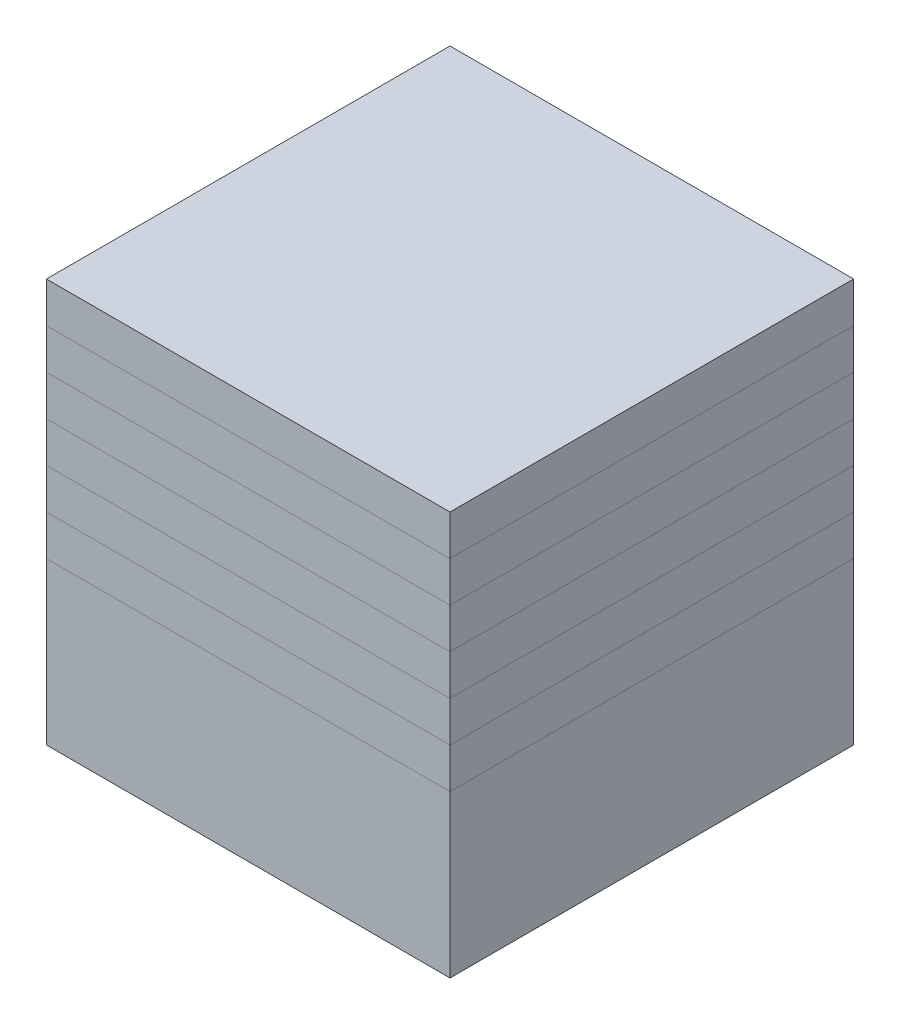
ISO-10303-21;
HEADER;
FILE_DESCRIPTION(('STEP AP214'),'2;1');
FILE_NAME('part.step','',(''),(''),'','','');
FILE_SCHEMA(('AUTOMOTIVE_DESIGN { 1 0 10303 214 1 1 1 1 }'));
ENDSEC;
DATA;
#1=APPLICATION_CONTEXT('core data for automotive mechanical design processes');
#2=APPLICATION_PROTOCOL_DEFINITION('international standard','automotive_design',2000,#1);
#3=PRODUCT_CONTEXT('',#1,'mechanical');
#4=PRODUCT('Part','Part','',(#3));
#5=PRODUCT_RELATED_PRODUCT_CATEGORY('part','',(#4));
#6=PRODUCT_DEFINITION_FORMATION('','',#4);
#7=PRODUCT_DEFINITION_CONTEXT('part definition',#1,'design');
#8=PRODUCT_DEFINITION('design','',#6,#7);
#9=PRODUCT_DEFINITION_SHAPE('','',#8);
#10=(LENGTH_UNIT() NAMED_UNIT(*) SI_UNIT(.MILLI.,.METRE.));
#11=(NAMED_UNIT(*) PLANE_ANGLE_UNIT() SI_UNIT($,.RADIAN.));
#12=(NAMED_UNIT(*) SI_UNIT($,.STERADIAN.) SOLID_ANGLE_UNIT());
#13=UNCERTAINTY_MEASURE_WITH_UNIT(LENGTH_MEASURE(1.E-05),#10,'distance_accuracy_value','');
#14=(GEOMETRIC_REPRESENTATION_CONTEXT(3) GLOBAL_UNCERTAINTY_ASSIGNED_CONTEXT((#13)) GLOBAL_UNIT_ASSIGNED_CONTEXT((#10,
#11,#12)) REPRESENTATION_CONTEXT('',''));
#15=CARTESIAN_POINT('',(0.,0.,0.));
#16=DIRECTION('',(0.,0.,1.));
#17=DIRECTION('',(1.,0.,0.));
#18=AXIS2_PLACEMENT_3D('',#15,#16,#17);
#19=CARTESIAN_POINT('',(0.,5.,0.));
#20=DIRECTION('',(1.,0.,0.));
#21=DIRECTION('',(0.,0.,-1.));
#22=AXIS2_PLACEMENT_3D('',#19,#20,#21);
#23=PLANE('',#22);
#24=DIRECTION('',(0.,0.,1.));
#25=VECTOR('',#24,1.);
#26=CARTESIAN_POINT('',(0.,0.,0.));
#27=LINE('',#26,#25);
#28=CARTESIAN_POINT('',(0.,0.,0.));
#29=VERTEX_POINT('',#28);
#30=CARTESIAN_POINT('',(0.,0.,50.));
#31=VERTEX_POINT('',#30);
#32=EDGE_CURVE('E103',#29,#31,#27,.T.);
#33=ORIENTED_EDGE('',*,*,#32,.T.);
#34=DIRECTION('',(0.,-1.,0.));
#35=VECTOR('',#34,1.);
#36=CARTESIAN_POINT('',(0.,5.,50.));
#37=LINE('',#36,#35);
#38=CARTESIAN_POINT('',(0.,20.,50.));
#39=VERTEX_POINT('',#38);
#40=EDGE_CURVE('E12',#39,#31,#37,.T.);
#41=ORIENTED_EDGE('',*,*,#40,.F.);
#42=DIRECTION('',(0.,0.,1.));
#43=VECTOR('',#42,1.);
#44=CARTESIAN_POINT('',(0.,20.,0.));
#45=LINE('',#44,#43);
#46=CARTESIAN_POINT('',(0.,20.,0.));
#47=VERTEX_POINT('',#46);
#48=EDGE_CURVE('E101',#47,#39,#45,.T.);
#49=ORIENTED_EDGE('',*,*,#48,.F.);
#50=DIRECTION('',(0.,-1.,0.));
#51=VECTOR('',#50,1.);
#52=CARTESIAN_POINT('',(0.,5.,0.));
#53=LINE('',#52,#51);
#54=EDGE_CURVE('E126',#47,#29,#53,.T.);
#55=ORIENTED_EDGE('',*,*,#54,.T.);
#56=EDGE_LOOP('',(#33,#41,#49,#55));
#57=FACE_BOUND('',#56,.T.);
#58=ADVANCED_FACE('F58',(#57),#23,.F.);
#59=CARTESIAN_POINT('',(0.,5.,50.));
#60=DIRECTION('',(0.,0.,-1.));
#61=DIRECTION('',(-1.,0.,0.));
#62=AXIS2_PLACEMENT_3D('',#59,#60,#61);
#63=PLANE('',#62);
#64=DIRECTION('',(1.,0.,0.));
#65=VECTOR('',#64,1.);
#66=CARTESIAN_POINT('',(0.,0.,50.));
#67=LINE('',#66,#65);
#68=CARTESIAN_POINT('',(50.,0.,50.));
#69=VERTEX_POINT('',#68);
#70=EDGE_CURVE('E122',#31,#69,#67,.T.);
#71=ORIENTED_EDGE('',*,*,#70,.T.);
#72=DIRECTION('',(0.,-1.,0.));
#73=VECTOR('',#72,1.);
#74=CARTESIAN_POINT('',(50.,5.,50.));
#75=LINE('',#74,#73);
#76=CARTESIAN_POINT('',(50.,20.,50.));
#77=VERTEX_POINT('',#76);
#78=EDGE_CURVE('E65',#77,#69,#75,.T.);
#79=ORIENTED_EDGE('',*,*,#78,.F.);
#80=DIRECTION('',(1.,0.,0.));
#81=VECTOR('',#80,1.);
#82=CARTESIAN_POINT('',(0.,20.,50.));
#83=LINE('',#82,#81);
#84=EDGE_CURVE('E106',#39,#77,#83,.T.);
#85=ORIENTED_EDGE('',*,*,#84,.F.);
#86=ORIENTED_EDGE('',*,*,#40,.T.);
#87=EDGE_LOOP('',(#71,#79,#85,#86));
#88=FACE_BOUND('',#87,.T.);
#89=ADVANCED_FACE('F107',(#88),#63,.F.);
#90=CARTESIAN_POINT('',(50.,5.,0.));
#91=DIRECTION('',(-1.,0.,0.));
#92=DIRECTION('',(0.,0.,1.));
#93=AXIS2_PLACEMENT_3D('',#90,#91,#92);
#94=PLANE('',#93);
#95=DIRECTION('',(0.,0.,-1.));
#96=VECTOR('',#95,1.);
#97=CARTESIAN_POINT('',(50.,0.,0.));
#98=LINE('',#97,#96);
#99=CARTESIAN_POINT('',(50.,0.,0.));
#100=VERTEX_POINT('',#99);
#101=EDGE_CURVE('E80',#69,#100,#98,.T.);
#102=ORIENTED_EDGE('',*,*,#101,.T.);
#103=DIRECTION('',(0.,-1.,0.));
#104=VECTOR('',#103,1.);
#105=CARTESIAN_POINT('',(50.,5.,0.));
#106=LINE('',#105,#104);
#107=CARTESIAN_POINT('',(50.,20.,0.));
#108=VERTEX_POINT('',#107);
#109=EDGE_CURVE('E128',#108,#100,#106,.T.);
#110=ORIENTED_EDGE('',*,*,#109,.F.);
#111=DIRECTION('',(0.,0.,-1.));
#112=VECTOR('',#111,1.);
#113=CARTESIAN_POINT('',(50.,20.,0.));
#114=LINE('',#113,#112);
#115=EDGE_CURVE('E111',#77,#108,#114,.T.);
#116=ORIENTED_EDGE('',*,*,#115,.F.);
#117=ORIENTED_EDGE('',*,*,#78,.T.);
#118=EDGE_LOOP('',(#102,#110,#116,#117));
#119=FACE_BOUND('',#118,.T.);
#120=ADVANCED_FACE('F129',(#119),#94,.F.);
#121=CARTESIAN_POINT('',(0.,5.,0.));
#122=DIRECTION('',(0.,0.,1.));
#123=DIRECTION('',(1.,0.,0.));
#124=AXIS2_PLACEMENT_3D('',#121,#122,#123);
#125=PLANE('',#124);
#126=DIRECTION('',(-1.,0.,0.));
#127=VECTOR('',#126,1.);
#128=CARTESIAN_POINT('',(0.,0.,0.));
#129=LINE('',#128,#127);
#130=EDGE_CURVE('E72',#100,#29,#129,.T.);
#131=ORIENTED_EDGE('',*,*,#130,.T.);
#132=ORIENTED_EDGE('',*,*,#54,.F.);
#133=DIRECTION('',(-1.,0.,0.));
#134=VECTOR('',#133,1.);
#135=CARTESIAN_POINT('',(0.,20.,0.));
#136=LINE('',#135,#134);
#137=EDGE_CURVE('E116',#108,#47,#136,.T.);
#138=ORIENTED_EDGE('',*,*,#137,.F.);
#139=ORIENTED_EDGE('',*,*,#109,.T.);
#140=EDGE_LOOP('',(#131,#132,#138,#139));
#141=FACE_BOUND('',#140,.T.);
#142=ADVANCED_FACE('F133',(#141),#125,.F.);
#143=CARTESIAN_POINT('',(0.,0.,0.));
#144=DIRECTION('',(0.,1.,0.));
#145=DIRECTION('',(0.,0.,1.));
#146=AXIS2_PLACEMENT_3D('',#143,#144,#145);
#147=PLANE('',#146);
#148=ORIENTED_EDGE('',*,*,#32,.F.);
#149=ORIENTED_EDGE('',*,*,#130,.F.);
#150=ORIENTED_EDGE('',*,*,#101,.F.);
#151=ORIENTED_EDGE('',*,*,#70,.F.);
#152=EDGE_LOOP('',(#148,#149,#150,#151));
#153=FACE_BOUND('',#152,.T.);
#154=ADVANCED_FACE('F131',(#153),#147,.F.);
#155=CARTESIAN_POINT('',(0.,20.,0.));
#156=DIRECTION('',(0.,1.,0.));
#157=DIRECTION('',(0.,0.,1.));
#158=AXIS2_PLACEMENT_3D('',#155,#156,#157);
#159=PLANE('',#158);
#160=ORIENTED_EDGE('',*,*,#48,.T.);
#161=ORIENTED_EDGE('',*,*,#84,.T.);
#162=ORIENTED_EDGE('',*,*,#115,.T.);
#163=ORIENTED_EDGE('',*,*,#137,.T.);
#164=EDGE_LOOP('',(#160,#161,#162,#163));
#165=FACE_BOUND('',#164,.T.);
#166=ADVANCED_FACE('F114',(#165),#159,.T.);
#167=CLOSED_SHELL('',(#58,#89,#120,#142,#154,#166));
#168=MANIFOLD_SOLID_BREP('B2',#167);
#169=CARTESIAN_POINT('',(0.,50.,0.));
#170=DIRECTION('',(1.,0.,0.));
#171=DIRECTION('',(0.,0.,-1.));
#172=AXIS2_PLACEMENT_3D('',#169,#170,#171);
#173=PLANE('',#172);
#174=DIRECTION('',(0.,0.,1.));
#175=VECTOR('',#174,1.);
#176=CARTESIAN_POINT('',(0.,45.,0.));
#177=LINE('',#176,#175);
#178=CARTESIAN_POINT('',(0.,45.,0.));
#179=VERTEX_POINT('',#178);
#180=CARTESIAN_POINT('',(0.,45.,50.));
#181=VERTEX_POINT('',#180);
#182=EDGE_CURVE('E296',#179,#181,#177,.T.);
#183=ORIENTED_EDGE('',*,*,#182,.T.);
#184=DIRECTION('',(0.,-1.,0.));
#185=VECTOR('',#184,1.);
#186=CARTESIAN_POINT('',(0.,50.,50.));
#187=LINE('',#186,#185);
#188=CARTESIAN_POINT('',(0.,50.,50.));
#189=VERTEX_POINT('',#188);
#190=EDGE_CURVE('E56',#189,#181,#187,.T.);
#191=ORIENTED_EDGE('',*,*,#190,.F.);
#192=DIRECTION('',(0.,0.,1.));
#193=VECTOR('',#192,1.);
#194=CARTESIAN_POINT('',(0.,50.,0.));
#195=LINE('',#194,#193);
#196=CARTESIAN_POINT('',(0.,50.,0.));
#197=VERTEX_POINT('',#196);
#198=EDGE_CURVE('E284',#197,#189,#195,.T.);
#199=ORIENTED_EDGE('',*,*,#198,.F.);
#200=DIRECTION('',(0.,-1.,0.));
#201=VECTOR('',#200,1.);
#202=CARTESIAN_POINT('',(0.,50.,0.));
#203=LINE('',#202,#201);
#204=EDGE_CURVE('E292',#197,#179,#203,.T.);
#205=ORIENTED_EDGE('',*,*,#204,.T.);
#206=EDGE_LOOP('',(#183,#191,#199,#205));
#207=FACE_BOUND('',#206,.T.);
#208=ADVANCED_FACE('F233',(#207),#173,.F.);
#209=CARTESIAN_POINT('',(0.,50.,50.));
#210=DIRECTION('',(0.,0.,-1.));
#211=DIRECTION('',(-1.,0.,0.));
#212=AXIS2_PLACEMENT_3D('',#209,#210,#211);
#213=PLANE('',#212);
#214=DIRECTION('',(1.,0.,0.));
#215=VECTOR('',#214,1.);
#216=CARTESIAN_POINT('',(0.,45.,50.));
#217=LINE('',#216,#215);
#218=CARTESIAN_POINT('',(50.,45.,50.));
#219=VERTEX_POINT('',#218);
#220=EDGE_CURVE('E288',#181,#219,#217,.T.);
#221=ORIENTED_EDGE('',*,*,#220,.T.);
#222=DIRECTION('',(0.,-1.,0.));
#223=VECTOR('',#222,1.);
#224=CARTESIAN_POINT('',(50.,50.,50.));
#225=LINE('',#224,#223);
#226=CARTESIAN_POINT('',(50.,50.,50.));
#227=VERTEX_POINT('',#226);
#228=EDGE_CURVE('E241',#227,#219,#225,.T.);
#229=ORIENTED_EDGE('',*,*,#228,.F.);
#230=DIRECTION('',(1.,0.,0.));
#231=VECTOR('',#230,1.);
#232=CARTESIAN_POINT('',(0.,50.,50.));
#233=LINE('',#232,#231);
#234=EDGE_CURVE('E279',#189,#227,#233,.T.);
#235=ORIENTED_EDGE('',*,*,#234,.F.);
#236=ORIENTED_EDGE('',*,*,#190,.T.);
#237=EDGE_LOOP('',(#221,#229,#235,#236));
#238=FACE_BOUND('',#237,.T.);
#239=ADVANCED_FACE('F287',(#238),#213,.F.);
#240=CARTESIAN_POINT('',(50.,50.,0.));
#241=DIRECTION('',(-1.,0.,0.));
#242=DIRECTION('',(0.,0.,1.));
#243=AXIS2_PLACEMENT_3D('',#240,#241,#242);
#244=PLANE('',#243);
#245=DIRECTION('',(0.,0.,-1.));
#246=VECTOR('',#245,1.);
#247=CARTESIAN_POINT('',(50.,45.,0.));
#248=LINE('',#247,#246);
#249=CARTESIAN_POINT('',(50.,45.,0.));
#250=VERTEX_POINT('',#249);
#251=EDGE_CURVE('E266',#219,#250,#248,.T.);
#252=ORIENTED_EDGE('',*,*,#251,.T.);
#253=DIRECTION('',(0.,-1.,0.));
#254=VECTOR('',#253,1.);
#255=CARTESIAN_POINT('',(50.,50.,0.));
#256=LINE('',#255,#254);
#257=CARTESIAN_POINT('',(50.,50.,0.));
#258=VERTEX_POINT('',#257);
#259=EDGE_CURVE('E289',#258,#250,#256,.T.);
#260=ORIENTED_EDGE('',*,*,#259,.F.);
#261=DIRECTION('',(0.,0.,-1.));
#262=VECTOR('',#261,1.);
#263=CARTESIAN_POINT('',(50.,50.,0.));
#264=LINE('',#263,#262);
#265=EDGE_CURVE('E282',#227,#258,#264,.T.);
#266=ORIENTED_EDGE('',*,*,#265,.F.);
#267=ORIENTED_EDGE('',*,*,#228,.T.);
#268=EDGE_LOOP('',(#252,#260,#266,#267));
#269=FACE_BOUND('',#268,.T.);
#270=ADVANCED_FACE('F290',(#269),#244,.F.);
#271=CARTESIAN_POINT('',(0.,50.,0.));
#272=DIRECTION('',(0.,0.,1.));
#273=DIRECTION('',(1.,0.,0.));
#274=AXIS2_PLACEMENT_3D('',#271,#272,#273);
#275=PLANE('',#274);
#276=DIRECTION('',(-1.,0.,0.));
#277=VECTOR('',#276,1.);
#278=CARTESIAN_POINT('',(0.,45.,0.));
#279=LINE('',#278,#277);
#280=EDGE_CURVE('E272',#250,#179,#279,.T.);
#281=ORIENTED_EDGE('',*,*,#280,.T.);
#282=ORIENTED_EDGE('',*,*,#204,.F.);
#283=DIRECTION('',(-1.,0.,0.));
#284=VECTOR('',#283,1.);
#285=CARTESIAN_POINT('',(0.,50.,0.));
#286=LINE('',#285,#284);
#287=EDGE_CURVE('E249',#258,#197,#286,.T.);
#288=ORIENTED_EDGE('',*,*,#287,.F.);
#289=ORIENTED_EDGE('',*,*,#259,.T.);
#290=EDGE_LOOP('',(#281,#282,#288,#289));
#291=FACE_BOUND('',#290,.T.);
#292=ADVANCED_FACE('F303',(#291),#275,.F.);
#293=CARTESIAN_POINT('',(0.,50.,0.));
#294=DIRECTION('',(0.,1.,0.));
#295=DIRECTION('',(0.,0.,1.));
#296=AXIS2_PLACEMENT_3D('',#293,#294,#295);
#297=PLANE('',#296);
#298=ORIENTED_EDGE('',*,*,#198,.T.);
#299=ORIENTED_EDGE('',*,*,#234,.T.);
#300=ORIENTED_EDGE('',*,*,#265,.T.);
#301=ORIENTED_EDGE('',*,*,#287,.T.);
#302=EDGE_LOOP('',(#298,#299,#300,#301));
#303=FACE_BOUND('',#302,.T.);
#304=ADVANCED_FACE('F280',(#303),#297,.T.);
#305=CARTESIAN_POINT('',(0.,45.,0.));
#306=DIRECTION('',(0.,1.,0.));
#307=DIRECTION('',(0.,0.,1.));
#308=AXIS2_PLACEMENT_3D('',#305,#306,#307);
#309=PLANE('',#308);
#310=ORIENTED_EDGE('',*,*,#182,.F.);
#311=ORIENTED_EDGE('',*,*,#280,.F.);
#312=ORIENTED_EDGE('',*,*,#251,.F.);
#313=ORIENTED_EDGE('',*,*,#220,.F.);
#314=EDGE_LOOP('',(#310,#311,#312,#313));
#315=FACE_BOUND('',#314,.T.);
#316=ADVANCED_FACE('F306',(#315),#309,.F.);
#317=CLOSED_SHELL('',(#208,#239,#270,#292,#304,#316));
#318=MANIFOLD_SOLID_BREP('B6',#317);
#319=CARTESIAN_POINT('',(0.,45.,0.));
#320=DIRECTION('',(1.,0.,0.));
#321=DIRECTION('',(0.,0.,-1.));
#322=AXIS2_PLACEMENT_3D('',#319,#320,#321);
#323=PLANE('',#322);
#324=DIRECTION('',(0.,0.,1.));
#325=VECTOR('',#324,1.);
#326=CARTESIAN_POINT('',(0.,40.,0.));
#327=LINE('',#326,#325);
#328=CARTESIAN_POINT('',(0.,40.,0.));
#329=VERTEX_POINT('',#328);
#330=CARTESIAN_POINT('',(0.,40.,50.));
#331=VERTEX_POINT('',#330);
#332=EDGE_CURVE('E430',#329,#331,#327,.T.);
#333=ORIENTED_EDGE('',*,*,#332,.T.);
#334=DIRECTION('',(0.,-1.,0.));
#335=VECTOR('',#334,1.);
#336=CARTESIAN_POINT('',(0.,45.,50.));
#337=LINE('',#336,#335);
#338=CARTESIAN_POINT('',(0.,45.,50.));
#339=VERTEX_POINT('',#338);
#340=EDGE_CURVE('E231',#339,#331,#337,.T.);
#341=ORIENTED_EDGE('',*,*,#340,.F.);
#342=DIRECTION('',(0.,0.,1.));
#343=VECTOR('',#342,1.);
#344=CARTESIAN_POINT('',(0.,45.,0.));
#345=LINE('',#344,#343);
#346=CARTESIAN_POINT('',(0.,45.,0.));
#347=VERTEX_POINT('',#346);
#348=EDGE_CURVE('E418',#347,#339,#345,.T.);
#349=ORIENTED_EDGE('',*,*,#348,.F.);
#350=DIRECTION('',(0.,-1.,0.));
#351=VECTOR('',#350,1.);
#352=CARTESIAN_POINT('',(0.,45.,0.));
#353=LINE('',#352,#351);
#354=EDGE_CURVE('E426',#347,#329,#353,.T.);
#355=ORIENTED_EDGE('',*,*,#354,.T.);
#356=EDGE_LOOP('',(#333,#341,#349,#355));
#357=FACE_BOUND('',#356,.T.);
#358=ADVANCED_FACE('F367',(#357),#323,.F.);
#359=CARTESIAN_POINT('',(0.,45.,50.));
#360=DIRECTION('',(0.,0.,-1.));
#361=DIRECTION('',(-1.,0.,0.));
#362=AXIS2_PLACEMENT_3D('',#359,#360,#361);
#363=PLANE('',#362);
#364=DIRECTION('',(1.,0.,0.));
#365=VECTOR('',#364,1.);
#366=CARTESIAN_POINT('',(0.,40.,50.));
#367=LINE('',#366,#365);
#368=CARTESIAN_POINT('',(50.,40.,50.));
#369=VERTEX_POINT('',#368);
#370=EDGE_CURVE('E422',#331,#369,#367,.T.);
#371=ORIENTED_EDGE('',*,*,#370,.T.);
#372=DIRECTION('',(0.,-1.,0.));
#373=VECTOR('',#372,1.);
#374=CARTESIAN_POINT('',(50.,45.,50.));
#375=LINE('',#374,#373);
#376=CARTESIAN_POINT('',(50.,45.,50.));
#377=VERTEX_POINT('',#376);
#378=EDGE_CURVE('E375',#377,#369,#375,.T.);
#379=ORIENTED_EDGE('',*,*,#378,.F.);
#380=DIRECTION('',(1.,0.,0.));
#381=VECTOR('',#380,1.);
#382=CARTESIAN_POINT('',(0.,45.,50.));
#383=LINE('',#382,#381);
#384=EDGE_CURVE('E413',#339,#377,#383,.T.);
#385=ORIENTED_EDGE('',*,*,#384,.F.);
#386=ORIENTED_EDGE('',*,*,#340,.T.);
#387=EDGE_LOOP('',(#371,#379,#385,#386));
#388=FACE_BOUND('',#387,.T.);
#389=ADVANCED_FACE('F421',(#388),#363,.F.);
#390=CARTESIAN_POINT('',(50.,45.,0.));
#391=DIRECTION('',(-1.,0.,0.));
#392=DIRECTION('',(0.,0.,1.));
#393=AXIS2_PLACEMENT_3D('',#390,#391,#392);
#394=PLANE('',#393);
#395=DIRECTION('',(0.,0.,-1.));
#396=VECTOR('',#395,1.);
#397=CARTESIAN_POINT('',(50.,40.,0.));
#398=LINE('',#397,#396);
#399=CARTESIAN_POINT('',(50.,40.,0.));
#400=VERTEX_POINT('',#399);
#401=EDGE_CURVE('E400',#369,#400,#398,.T.);
#402=ORIENTED_EDGE('',*,*,#401,.T.);
#403=DIRECTION('',(0.,-1.,0.));
#404=VECTOR('',#403,1.);
#405=CARTESIAN_POINT('',(50.,45.,0.));
#406=LINE('',#405,#404);
#407=CARTESIAN_POINT('',(50.,45.,0.));
#408=VERTEX_POINT('',#407);
#409=EDGE_CURVE('E423',#408,#400,#406,.T.);
#410=ORIENTED_EDGE('',*,*,#409,.F.);
#411=DIRECTION('',(0.,0.,-1.));
#412=VECTOR('',#411,1.);
#413=CARTESIAN_POINT('',(50.,45.,0.));
#414=LINE('',#413,#412);
#415=EDGE_CURVE('E416',#377,#408,#414,.T.);
#416=ORIENTED_EDGE('',*,*,#415,.F.);
#417=ORIENTED_EDGE('',*,*,#378,.T.);
#418=EDGE_LOOP('',(#402,#410,#416,#417));
#419=FACE_BOUND('',#418,.T.);
#420=ADVANCED_FACE('F424',(#419),#394,.F.);
#421=CARTESIAN_POINT('',(0.,45.,0.));
#422=DIRECTION('',(0.,0.,1.));
#423=DIRECTION('',(1.,0.,0.));
#424=AXIS2_PLACEMENT_3D('',#421,#422,#423);
#425=PLANE('',#424);
#426=DIRECTION('',(-1.,0.,0.));
#427=VECTOR('',#426,1.);
#428=CARTESIAN_POINT('',(0.,40.,0.));
#429=LINE('',#428,#427);
#430=EDGE_CURVE('E406',#400,#329,#429,.T.);
#431=ORIENTED_EDGE('',*,*,#430,.T.);
#432=ORIENTED_EDGE('',*,*,#354,.F.);
#433=DIRECTION('',(-1.,0.,0.));
#434=VECTOR('',#433,1.);
#435=CARTESIAN_POINT('',(0.,45.,0.));
#436=LINE('',#435,#434);
#437=EDGE_CURVE('E383',#408,#347,#436,.T.);
#438=ORIENTED_EDGE('',*,*,#437,.F.);
#439=ORIENTED_EDGE('',*,*,#409,.T.);
#440=EDGE_LOOP('',(#431,#432,#438,#439));
#441=FACE_BOUND('',#440,.T.);
#442=ADVANCED_FACE('F437',(#441),#425,.F.);
#443=CARTESIAN_POINT('',(0.,45.,0.));
#444=DIRECTION('',(0.,1.,0.));
#445=DIRECTION('',(0.,0.,1.));
#446=AXIS2_PLACEMENT_3D('',#443,#444,#445);
#447=PLANE('',#446);
#448=ORIENTED_EDGE('',*,*,#348,.T.);
#449=ORIENTED_EDGE('',*,*,#384,.T.);
#450=ORIENTED_EDGE('',*,*,#415,.T.);
#451=ORIENTED_EDGE('',*,*,#437,.T.);
#452=EDGE_LOOP('',(#448,#449,#450,#451));
#453=FACE_BOUND('',#452,.T.);
#454=ADVANCED_FACE('F414',(#453),#447,.T.);
#455=CARTESIAN_POINT('',(0.,40.,0.));
#456=DIRECTION('',(0.,1.,0.));
#457=DIRECTION('',(0.,0.,1.));
#458=AXIS2_PLACEMENT_3D('',#455,#456,#457);
#459=PLANE('',#458);
#460=ORIENTED_EDGE('',*,*,#332,.F.);
#461=ORIENTED_EDGE('',*,*,#430,.F.);
#462=ORIENTED_EDGE('',*,*,#401,.F.);
#463=ORIENTED_EDGE('',*,*,#370,.F.);
#464=EDGE_LOOP('',(#460,#461,#462,#463));
#465=FACE_BOUND('',#464,.T.);
#466=ADVANCED_FACE('F440',(#465),#459,.F.);
#467=CLOSED_SHELL('',(#358,#389,#420,#442,#454,#466));
#468=MANIFOLD_SOLID_BREP('B50',#467);
#469=CARTESIAN_POINT('',(0.,40.,0.));
#470=DIRECTION('',(1.,0.,0.));
#471=DIRECTION('',(0.,0.,-1.));
#472=AXIS2_PLACEMENT_3D('',#469,#470,#471);
#473=PLANE('',#472);
#474=DIRECTION('',(0.,0.,1.));
#475=VECTOR('',#474,1.);
#476=CARTESIAN_POINT('',(0.,35.,0.));
#477=LINE('',#476,#475);
#478=CARTESIAN_POINT('',(0.,35.,0.));
#479=VERTEX_POINT('',#478);
#480=CARTESIAN_POINT('',(0.,35.,50.));
#481=VERTEX_POINT('',#480);
#482=EDGE_CURVE('E564',#479,#481,#477,.T.);
#483=ORIENTED_EDGE('',*,*,#482,.T.);
#484=DIRECTION('',(0.,-1.,0.));
#485=VECTOR('',#484,1.);
#486=CARTESIAN_POINT('',(0.,40.,50.));
#487=LINE('',#486,#485);
#488=CARTESIAN_POINT('',(0.,40.,50.));
#489=VERTEX_POINT('',#488);
#490=EDGE_CURVE('E365',#489,#481,#487,.T.);
#491=ORIENTED_EDGE('',*,*,#490,.F.);
#492=DIRECTION('',(0.,0.,1.));
#493=VECTOR('',#492,1.);
#494=CARTESIAN_POINT('',(0.,40.,0.));
#495=LINE('',#494,#493);
#496=CARTESIAN_POINT('',(0.,40.,0.));
#497=VERTEX_POINT('',#496);
#498=EDGE_CURVE('E552',#497,#489,#495,.T.);
#499=ORIENTED_EDGE('',*,*,#498,.F.);
#500=DIRECTION('',(0.,-1.,0.));
#501=VECTOR('',#500,1.);
#502=CARTESIAN_POINT('',(0.,40.,0.));
#503=LINE('',#502,#501);
#504=EDGE_CURVE('E560',#497,#479,#503,.T.);
#505=ORIENTED_EDGE('',*,*,#504,.T.);
#506=EDGE_LOOP('',(#483,#491,#499,#505));
#507=FACE_BOUND('',#506,.T.);
#508=ADVANCED_FACE('F501',(#507),#473,.F.);
#509=CARTESIAN_POINT('',(0.,40.,50.));
#510=DIRECTION('',(0.,0.,-1.));
#511=DIRECTION('',(-1.,0.,0.));
#512=AXIS2_PLACEMENT_3D('',#509,#510,#511);
#513=PLANE('',#512);
#514=DIRECTION('',(1.,0.,0.));
#515=VECTOR('',#514,1.);
#516=CARTESIAN_POINT('',(0.,35.,50.));
#517=LINE('',#516,#515);
#518=CARTESIAN_POINT('',(50.,35.,50.));
#519=VERTEX_POINT('',#518);
#520=EDGE_CURVE('E556',#481,#519,#517,.T.);
#521=ORIENTED_EDGE('',*,*,#520,.T.);
#522=DIRECTION('',(0.,-1.,0.));
#523=VECTOR('',#522,1.);
#524=CARTESIAN_POINT('',(50.,40.,50.));
#525=LINE('',#524,#523);
#526=CARTESIAN_POINT('',(50.,40.,50.));
#527=VERTEX_POINT('',#526);
#528=EDGE_CURVE('E509',#527,#519,#525,.T.);
#529=ORIENTED_EDGE('',*,*,#528,.F.);
#530=DIRECTION('',(1.,0.,0.));
#531=VECTOR('',#530,1.);
#532=CARTESIAN_POINT('',(0.,40.,50.));
#533=LINE('',#532,#531);
#534=EDGE_CURVE('E547',#489,#527,#533,.T.);
#535=ORIENTED_EDGE('',*,*,#534,.F.);
#536=ORIENTED_EDGE('',*,*,#490,.T.);
#537=EDGE_LOOP('',(#521,#529,#535,#536));
#538=FACE_BOUND('',#537,.T.);
#539=ADVANCED_FACE('F555',(#538),#513,.F.);
#540=CARTESIAN_POINT('',(50.,40.,0.));
#541=DIRECTION('',(-1.,0.,0.));
#542=DIRECTION('',(0.,0.,1.));
#543=AXIS2_PLACEMENT_3D('',#540,#541,#542);
#544=PLANE('',#543);
#545=DIRECTION('',(0.,0.,-1.));
#546=VECTOR('',#545,1.);
#547=CARTESIAN_POINT('',(50.,35.,0.));
#548=LINE('',#547,#546);
#549=CARTESIAN_POINT('',(50.,35.,0.));
#550=VERTEX_POINT('',#549);
#551=EDGE_CURVE('E534',#519,#550,#548,.T.);
#552=ORIENTED_EDGE('',*,*,#551,.T.);
#553=DIRECTION('',(0.,-1.,0.));
#554=VECTOR('',#553,1.);
#555=CARTESIAN_POINT('',(50.,40.,0.));
#556=LINE('',#555,#554);
#557=CARTESIAN_POINT('',(50.,40.,0.));
#558=VERTEX_POINT('',#557);
#559=EDGE_CURVE('E557',#558,#550,#556,.T.);
#560=ORIENTED_EDGE('',*,*,#559,.F.);
#561=DIRECTION('',(0.,0.,-1.));
#562=VECTOR('',#561,1.);
#563=CARTESIAN_POINT('',(50.,40.,0.));
#564=LINE('',#563,#562);
#565=EDGE_CURVE('E550',#527,#558,#564,.T.);
#566=ORIENTED_EDGE('',*,*,#565,.F.);
#567=ORIENTED_EDGE('',*,*,#528,.T.);
#568=EDGE_LOOP('',(#552,#560,#566,#567));
#569=FACE_BOUND('',#568,.T.);
#570=ADVANCED_FACE('F558',(#569),#544,.F.);
#571=CARTESIAN_POINT('',(0.,40.,0.));
#572=DIRECTION('',(0.,0.,1.));
#573=DIRECTION('',(1.,0.,0.));
#574=AXIS2_PLACEMENT_3D('',#571,#572,#573);
#575=PLANE('',#574);
#576=DIRECTION('',(-1.,0.,0.));
#577=VECTOR('',#576,1.);
#578=CARTESIAN_POINT('',(0.,35.,0.));
#579=LINE('',#578,#577);
#580=EDGE_CURVE('E540',#550,#479,#579,.T.);
#581=ORIENTED_EDGE('',*,*,#580,.T.);
#582=ORIENTED_EDGE('',*,*,#504,.F.);
#583=DIRECTION('',(-1.,0.,0.));
#584=VECTOR('',#583,1.);
#585=CARTESIAN_POINT('',(0.,40.,0.));
#586=LINE('',#585,#584);
#587=EDGE_CURVE('E517',#558,#497,#586,.T.);
#588=ORIENTED_EDGE('',*,*,#587,.F.);
#589=ORIENTED_EDGE('',*,*,#559,.T.);
#590=EDGE_LOOP('',(#581,#582,#588,#589));
#591=FACE_BOUND('',#590,.T.);
#592=ADVANCED_FACE('F571',(#591),#575,.F.);
#593=CARTESIAN_POINT('',(0.,40.,0.));
#594=DIRECTION('',(0.,1.,0.));
#595=DIRECTION('',(0.,0.,1.));
#596=AXIS2_PLACEMENT_3D('',#593,#594,#595);
#597=PLANE('',#596);
#598=ORIENTED_EDGE('',*,*,#498,.T.);
#599=ORIENTED_EDGE('',*,*,#534,.T.);
#600=ORIENTED_EDGE('',*,*,#565,.T.);
#601=ORIENTED_EDGE('',*,*,#587,.T.);
#602=EDGE_LOOP('',(#598,#599,#600,#601));
#603=FACE_BOUND('',#602,.T.);
#604=ADVANCED_FACE('F548',(#603),#597,.T.);
#605=CARTESIAN_POINT('',(0.,35.,0.));
#606=DIRECTION('',(0.,1.,0.));
#607=DIRECTION('',(0.,0.,1.));
#608=AXIS2_PLACEMENT_3D('',#605,#606,#607);
#609=PLANE('',#608);
#610=ORIENTED_EDGE('',*,*,#482,.F.);
#611=ORIENTED_EDGE('',*,*,#580,.F.);
#612=ORIENTED_EDGE('',*,*,#551,.F.);
#613=ORIENTED_EDGE('',*,*,#520,.F.);
#614=EDGE_LOOP('',(#610,#611,#612,#613));
#615=FACE_BOUND('',#614,.T.);
#616=ADVANCED_FACE('F574',(#615),#609,.F.);
#617=CLOSED_SHELL('',(#508,#539,#570,#592,#604,#616));
#618=MANIFOLD_SOLID_BREP('B225',#617);
#619=CARTESIAN_POINT('',(0.,35.,0.));
#620=DIRECTION('',(1.,0.,0.));
#621=DIRECTION('',(0.,0.,-1.));
#622=AXIS2_PLACEMENT_3D('',#619,#620,#621);
#623=PLANE('',#622);
#624=DIRECTION('',(0.,0.,1.));
#625=VECTOR('',#624,1.);
#626=CARTESIAN_POINT('',(0.,30.,0.));
#627=LINE('',#626,#625);
#628=CARTESIAN_POINT('',(0.,30.,0.));
#629=VERTEX_POINT('',#628);
#630=CARTESIAN_POINT('',(0.,30.,50.));
#631=VERTEX_POINT('',#630);
#632=EDGE_CURVE('E698',#629,#631,#627,.T.);
#633=ORIENTED_EDGE('',*,*,#632,.T.);
#634=DIRECTION('',(0.,-1.,0.));
#635=VECTOR('',#634,1.);
#636=CARTESIAN_POINT('',(0.,35.,50.));
#637=LINE('',#636,#635);
#638=CARTESIAN_POINT('',(0.,35.,50.));
#639=VERTEX_POINT('',#638);
#640=EDGE_CURVE('E499',#639,#631,#637,.T.);
#641=ORIENTED_EDGE('',*,*,#640,.F.);
#642=DIRECTION('',(0.,0.,1.));
#643=VECTOR('',#642,1.);
#644=CARTESIAN_POINT('',(0.,35.,0.));
#645=LINE('',#644,#643);
#646=CARTESIAN_POINT('',(0.,35.,0.));
#647=VERTEX_POINT('',#646);
#648=EDGE_CURVE('E686',#647,#639,#645,.T.);
#649=ORIENTED_EDGE('',*,*,#648,.F.);
#650=DIRECTION('',(0.,-1.,0.));
#651=VECTOR('',#650,1.);
#652=CARTESIAN_POINT('',(0.,35.,0.));
#653=LINE('',#652,#651);
#654=EDGE_CURVE('E694',#647,#629,#653,.T.);
#655=ORIENTED_EDGE('',*,*,#654,.T.);
#656=EDGE_LOOP('',(#633,#641,#649,#655));
#657=FACE_BOUND('',#656,.T.);
#658=ADVANCED_FACE('F635',(#657),#623,.F.);
#659=CARTESIAN_POINT('',(0.,35.,50.));
#660=DIRECTION('',(0.,0.,-1.));
#661=DIRECTION('',(-1.,0.,0.));
#662=AXIS2_PLACEMENT_3D('',#659,#660,#661);
#663=PLANE('',#662);
#664=DIRECTION('',(1.,0.,0.));
#665=VECTOR('',#664,1.);
#666=CARTESIAN_POINT('',(0.,30.,50.));
#667=LINE('',#666,#665);
#668=CARTESIAN_POINT('',(50.,30.,50.));
#669=VERTEX_POINT('',#668);
#670=EDGE_CURVE('E690',#631,#669,#667,.T.);
#671=ORIENTED_EDGE('',*,*,#670,.T.);
#672=DIRECTION('',(0.,-1.,0.));
#673=VECTOR('',#672,1.);
#674=CARTESIAN_POINT('',(50.,35.,50.));
#675=LINE('',#674,#673);
#676=CARTESIAN_POINT('',(50.,35.,50.));
#677=VERTEX_POINT('',#676);
#678=EDGE_CURVE('E643',#677,#669,#675,.T.);
#679=ORIENTED_EDGE('',*,*,#678,.F.);
#680=DIRECTION('',(1.,0.,0.));
#681=VECTOR('',#680,1.);
#682=CARTESIAN_POINT('',(0.,35.,50.));
#683=LINE('',#682,#681);
#684=EDGE_CURVE('E681',#639,#677,#683,.T.);
#685=ORIENTED_EDGE('',*,*,#684,.F.);
#686=ORIENTED_EDGE('',*,*,#640,.T.);
#687=EDGE_LOOP('',(#671,#679,#685,#686));
#688=FACE_BOUND('',#687,.T.);
#689=ADVANCED_FACE('F689',(#688),#663,.F.);
#690=CARTESIAN_POINT('',(50.,35.,0.));
#691=DIRECTION('',(-1.,0.,0.));
#692=DIRECTION('',(0.,0.,1.));
#693=AXIS2_PLACEMENT_3D('',#690,#691,#692);
#694=PLANE('',#693);
#695=DIRECTION('',(0.,0.,-1.));
#696=VECTOR('',#695,1.);
#697=CARTESIAN_POINT('',(50.,30.,0.));
#698=LINE('',#697,#696);
#699=CARTESIAN_POINT('',(50.,30.,0.));
#700=VERTEX_POINT('',#699);
#701=EDGE_CURVE('E668',#669,#700,#698,.T.);
#702=ORIENTED_EDGE('',*,*,#701,.T.);
#703=DIRECTION('',(0.,-1.,0.));
#704=VECTOR('',#703,1.);
#705=CARTESIAN_POINT('',(50.,35.,0.));
#706=LINE('',#705,#704);
#707=CARTESIAN_POINT('',(50.,35.,0.));
#708=VERTEX_POINT('',#707);
#709=EDGE_CURVE('E691',#708,#700,#706,.T.);
#710=ORIENTED_EDGE('',*,*,#709,.F.);
#711=DIRECTION('',(0.,0.,-1.));
#712=VECTOR('',#711,1.);
#713=CARTESIAN_POINT('',(50.,35.,0.));
#714=LINE('',#713,#712);
#715=EDGE_CURVE('E684',#677,#708,#714,.T.);
#716=ORIENTED_EDGE('',*,*,#715,.F.);
#717=ORIENTED_EDGE('',*,*,#678,.T.);
#718=EDGE_LOOP('',(#702,#710,#716,#717));
#719=FACE_BOUND('',#718,.T.);
#720=ADVANCED_FACE('F692',(#719),#694,.F.);
#721=CARTESIAN_POINT('',(0.,35.,0.));
#722=DIRECTION('',(0.,0.,1.));
#723=DIRECTION('',(1.,0.,0.));
#724=AXIS2_PLACEMENT_3D('',#721,#722,#723);
#725=PLANE('',#724);
#726=DIRECTION('',(-1.,0.,0.));
#727=VECTOR('',#726,1.);
#728=CARTESIAN_POINT('',(0.,30.,0.));
#729=LINE('',#728,#727);
#730=EDGE_CURVE('E674',#700,#629,#729,.T.);
#731=ORIENTED_EDGE('',*,*,#730,.T.);
#732=ORIENTED_EDGE('',*,*,#654,.F.);
#733=DIRECTION('',(-1.,0.,0.));
#734=VECTOR('',#733,1.);
#735=CARTESIAN_POINT('',(0.,35.,0.));
#736=LINE('',#735,#734);
#737=EDGE_CURVE('E651',#708,#647,#736,.T.);
#738=ORIENTED_EDGE('',*,*,#737,.F.);
#739=ORIENTED_EDGE('',*,*,#709,.T.);
#740=EDGE_LOOP('',(#731,#732,#738,#739));
#741=FACE_BOUND('',#740,.T.);
#742=ADVANCED_FACE('F705',(#741),#725,.F.);
#743=CARTESIAN_POINT('',(0.,35.,0.));
#744=DIRECTION('',(0.,1.,0.));
#745=DIRECTION('',(0.,0.,1.));
#746=AXIS2_PLACEMENT_3D('',#743,#744,#745);
#747=PLANE('',#746);
#748=ORIENTED_EDGE('',*,*,#648,.T.);
#749=ORIENTED_EDGE('',*,*,#684,.T.);
#750=ORIENTED_EDGE('',*,*,#715,.T.);
#751=ORIENTED_EDGE('',*,*,#737,.T.);
#752=EDGE_LOOP('',(#748,#749,#750,#751));
#753=FACE_BOUND('',#752,.T.);
#754=ADVANCED_FACE('F682',(#753),#747,.T.);
#755=CARTESIAN_POINT('',(0.,30.,0.));
#756=DIRECTION('',(0.,1.,0.));
#757=DIRECTION('',(0.,0.,1.));
#758=AXIS2_PLACEMENT_3D('',#755,#756,#757);
#759=PLANE('',#758);
#760=ORIENTED_EDGE('',*,*,#632,.F.);
#761=ORIENTED_EDGE('',*,*,#730,.F.);
#762=ORIENTED_EDGE('',*,*,#701,.F.);
#763=ORIENTED_EDGE('',*,*,#670,.F.);
#764=EDGE_LOOP('',(#760,#761,#762,#763));
#765=FACE_BOUND('',#764,.T.);
#766=ADVANCED_FACE('F708',(#765),#759,.F.);
#767=CLOSED_SHELL('',(#658,#689,#720,#742,#754,#766));
#768=MANIFOLD_SOLID_BREP('B359',#767);
#769=CARTESIAN_POINT('',(0.,30.,0.));
#770=DIRECTION('',(1.,0.,0.));
#771=DIRECTION('',(0.,0.,-1.));
#772=AXIS2_PLACEMENT_3D('',#769,#770,#771);
#773=PLANE('',#772);
#774=DIRECTION('',(0.,0.,1.));
#775=VECTOR('',#774,1.);
#776=CARTESIAN_POINT('',(0.,25.,0.));
#777=LINE('',#776,#775);
#778=CARTESIAN_POINT('',(0.,25.,0.));
#779=VERTEX_POINT('',#778);
#780=CARTESIAN_POINT('',(0.,25.,50.));
#781=VERTEX_POINT('',#780);
#782=EDGE_CURVE('E831',#779,#781,#777,.T.);
#783=ORIENTED_EDGE('',*,*,#782,.T.);
#784=DIRECTION('',(0.,-1.,0.));
#785=VECTOR('',#784,1.);
#786=CARTESIAN_POINT('',(0.,30.,50.));
#787=LINE('',#786,#785);
#788=CARTESIAN_POINT('',(0.,30.,50.));
#789=VERTEX_POINT('',#788);
#790=EDGE_CURVE('E633',#789,#781,#787,.T.);
#791=ORIENTED_EDGE('',*,*,#790,.F.);
#792=DIRECTION('',(0.,0.,1.));
#793=VECTOR('',#792,1.);
#794=CARTESIAN_POINT('',(0.,30.,0.));
#795=LINE('',#794,#793);
#796=CARTESIAN_POINT('',(0.,30.,0.));
#797=VERTEX_POINT('',#796);
#798=EDGE_CURVE('E819',#797,#789,#795,.T.);
#799=ORIENTED_EDGE('',*,*,#798,.F.);
#800=DIRECTION('',(0.,-1.,0.));
#801=VECTOR('',#800,1.);
#802=CARTESIAN_POINT('',(0.,30.,0.));
#803=LINE('',#802,#801);
#804=EDGE_CURVE('E827',#797,#779,#803,.T.);
#805=ORIENTED_EDGE('',*,*,#804,.T.);
#806=EDGE_LOOP('',(#783,#791,#799,#805));
#807=FACE_BOUND('',#806,.T.);
#808=ADVANCED_FACE('F768',(#807),#773,.F.);
#809=CARTESIAN_POINT('',(0.,30.,50.));
#810=DIRECTION('',(0.,0.,-1.));
#811=DIRECTION('',(-1.,0.,0.));
#812=AXIS2_PLACEMENT_3D('',#809,#810,#811);
#813=PLANE('',#812);
#814=DIRECTION('',(1.,0.,0.));
#815=VECTOR('',#814,1.);
#816=CARTESIAN_POINT('',(0.,25.,50.));
#817=LINE('',#816,#815);
#818=CARTESIAN_POINT('',(50.,25.,50.));
#819=VERTEX_POINT('',#818);
#820=EDGE_CURVE('E823',#781,#819,#817,.T.);
#821=ORIENTED_EDGE('',*,*,#820,.T.);
#822=DIRECTION('',(0.,-1.,0.));
#823=VECTOR('',#822,1.);
#824=CARTESIAN_POINT('',(50.,30.,50.));
#825=LINE('',#824,#823);
#826=CARTESIAN_POINT('',(50.,30.,50.));
#827=VERTEX_POINT('',#826);
#828=EDGE_CURVE('E776',#827,#819,#825,.T.);
#829=ORIENTED_EDGE('',*,*,#828,.F.);
#830=DIRECTION('',(1.,0.,0.));
#831=VECTOR('',#830,1.);
#832=CARTESIAN_POINT('',(0.,30.,50.));
#833=LINE('',#832,#831);
#834=EDGE_CURVE('E814',#789,#827,#833,.T.);
#835=ORIENTED_EDGE('',*,*,#834,.F.);
#836=ORIENTED_EDGE('',*,*,#790,.T.);
#837=EDGE_LOOP('',(#821,#829,#835,#836));
#838=FACE_BOUND('',#837,.T.);
#839=ADVANCED_FACE('F822',(#838),#813,.F.);
#840=CARTESIAN_POINT('',(50.,30.,0.));
#841=DIRECTION('',(-1.,0.,0.));
#842=DIRECTION('',(0.,0.,1.));
#843=AXIS2_PLACEMENT_3D('',#840,#841,#842);
#844=PLANE('',#843);
#845=DIRECTION('',(0.,0.,-1.));
#846=VECTOR('',#845,1.);
#847=CARTESIAN_POINT('',(50.,25.,0.));
#848=LINE('',#847,#846);
#849=CARTESIAN_POINT('',(50.,25.,0.));
#850=VERTEX_POINT('',#849);
#851=EDGE_CURVE('E801',#819,#850,#848,.T.);
#852=ORIENTED_EDGE('',*,*,#851,.T.);
#853=DIRECTION('',(0.,-1.,0.));
#854=VECTOR('',#853,1.);
#855=CARTESIAN_POINT('',(50.,30.,0.));
#856=LINE('',#855,#854);
#857=CARTESIAN_POINT('',(50.,30.,0.));
#858=VERTEX_POINT('',#857);
#859=EDGE_CURVE('E824',#858,#850,#856,.T.);
#860=ORIENTED_EDGE('',*,*,#859,.F.);
#861=DIRECTION('',(0.,0.,-1.));
#862=VECTOR('',#861,1.);
#863=CARTESIAN_POINT('',(50.,30.,0.));
#864=LINE('',#863,#862);
#865=EDGE_CURVE('E817',#827,#858,#864,.T.);
#866=ORIENTED_EDGE('',*,*,#865,.F.);
#867=ORIENTED_EDGE('',*,*,#828,.T.);
#868=EDGE_LOOP('',(#852,#860,#866,#867));
#869=FACE_BOUND('',#868,.T.);
#870=ADVANCED_FACE('F825',(#869),#844,.F.);
#871=CARTESIAN_POINT('',(0.,30.,0.));
#872=DIRECTION('',(0.,0.,1.));
#873=DIRECTION('',(1.,0.,0.));
#874=AXIS2_PLACEMENT_3D('',#871,#872,#873);
#875=PLANE('',#874);
#876=DIRECTION('',(-1.,0.,0.));
#877=VECTOR('',#876,1.);
#878=CARTESIAN_POINT('',(0.,25.,0.));
#879=LINE('',#878,#877);
#880=EDGE_CURVE('E807',#850,#779,#879,.T.);
#881=ORIENTED_EDGE('',*,*,#880,.T.);
#882=ORIENTED_EDGE('',*,*,#804,.F.);
#883=DIRECTION('',(-1.,0.,0.));
#884=VECTOR('',#883,1.);
#885=CARTESIAN_POINT('',(0.,30.,0.));
#886=LINE('',#885,#884);
#887=EDGE_CURVE('E784',#858,#797,#886,.T.);
#888=ORIENTED_EDGE('',*,*,#887,.F.);
#889=ORIENTED_EDGE('',*,*,#859,.T.);
#890=EDGE_LOOP('',(#881,#882,#888,#889));
#891=FACE_BOUND('',#890,.T.);
#892=ADVANCED_FACE('F838',(#891),#875,.F.);
#893=CARTESIAN_POINT('',(0.,30.,0.));
#894=DIRECTION('',(0.,1.,0.));
#895=DIRECTION('',(0.,0.,1.));
#896=AXIS2_PLACEMENT_3D('',#893,#894,#895);
#897=PLANE('',#896);
#898=ORIENTED_EDGE('',*,*,#798,.T.);
#899=ORIENTED_EDGE('',*,*,#834,.T.);
#900=ORIENTED_EDGE('',*,*,#865,.T.);
#901=ORIENTED_EDGE('',*,*,#887,.T.);
#902=EDGE_LOOP('',(#898,#899,#900,#901));
#903=FACE_BOUND('',#902,.T.);
#904=ADVANCED_FACE('F815',(#903),#897,.T.);
#905=CARTESIAN_POINT('',(0.,25.,0.));
#906=DIRECTION('',(0.,1.,0.));
#907=DIRECTION('',(0.,0.,1.));
#908=AXIS2_PLACEMENT_3D('',#905,#906,#907);
#909=PLANE('',#908);
#910=ORIENTED_EDGE('',*,*,#782,.F.);
#911=ORIENTED_EDGE('',*,*,#880,.F.);
#912=ORIENTED_EDGE('',*,*,#851,.F.);
#913=ORIENTED_EDGE('',*,*,#820,.F.);
#914=EDGE_LOOP('',(#910,#911,#912,#913));
#915=FACE_BOUND('',#914,.T.);
#916=ADVANCED_FACE('F841',(#915),#909,.F.);
#917=CLOSED_SHELL('',(#808,#839,#870,#892,#904,#916));
#918=MANIFOLD_SOLID_BREP('B493',#917);
#919=CARTESIAN_POINT('',(0.,25.,0.));
#920=DIRECTION('',(1.,0.,0.));
#921=DIRECTION('',(0.,0.,-1.));
#922=AXIS2_PLACEMENT_3D('',#919,#920,#921);
#923=PLANE('',#922);
#924=DIRECTION('',(0.,0.,1.));
#925=VECTOR('',#924,1.);
#926=CARTESIAN_POINT('',(0.,20.,0.));
#927=LINE('',#926,#925);
#928=CARTESIAN_POINT('',(0.,20.,0.));
#929=VERTEX_POINT('',#928);
#930=CARTESIAN_POINT('',(0.,20.,50.));
#931=VERTEX_POINT('',#930);
#932=EDGE_CURVE('E955',#929,#931,#927,.T.);
#933=ORIENTED_EDGE('',*,*,#932,.T.);
#934=DIRECTION('',(0.,-1.,0.));
#935=VECTOR('',#934,1.);
#936=CARTESIAN_POINT('',(0.,25.,50.));
#937=LINE('',#936,#935);
#938=CARTESIAN_POINT('',(0.,25.,50.));
#939=VERTEX_POINT('',#938);
#940=EDGE_CURVE('E766',#939,#931,#937,.T.);
#941=ORIENTED_EDGE('',*,*,#940,.F.);
#942=DIRECTION('',(0.,0.,1.));
#943=VECTOR('',#942,1.);
#944=CARTESIAN_POINT('',(0.,25.,0.));
#945=LINE('',#944,#943);
#946=CARTESIAN_POINT('',(0.,25.,0.));
#947=VERTEX_POINT('',#946);
#948=EDGE_CURVE('E943',#947,#939,#945,.T.);
#949=ORIENTED_EDGE('',*,*,#948,.F.);
#950=DIRECTION('',(0.,-1.,0.));
#951=VECTOR('',#950,1.);
#952=CARTESIAN_POINT('',(0.,25.,0.));
#953=LINE('',#952,#951);
#954=EDGE_CURVE('E951',#947,#929,#953,.T.);
#955=ORIENTED_EDGE('',*,*,#954,.T.);
#956=EDGE_LOOP('',(#933,#941,#949,#955));
#957=FACE_BOUND('',#956,.T.);
#958=ADVANCED_FACE('F892',(#957),#923,.F.);
#959=CARTESIAN_POINT('',(0.,25.,50.));
#960=DIRECTION('',(0.,0.,-1.));
#961=DIRECTION('',(-1.,0.,0.));
#962=AXIS2_PLACEMENT_3D('',#959,#960,#961);
#963=PLANE('',#962);
#964=DIRECTION('',(1.,0.,0.));
#965=VECTOR('',#964,1.);
#966=CARTESIAN_POINT('',(0.,20.,50.));
#967=LINE('',#966,#965);
#968=CARTESIAN_POINT('',(50.,20.,50.));
#969=VERTEX_POINT('',#968);
#970=EDGE_CURVE('E947',#931,#969,#967,.T.);
#971=ORIENTED_EDGE('',*,*,#970,.T.);
#972=DIRECTION('',(0.,-1.,0.));
#973=VECTOR('',#972,1.);
#974=CARTESIAN_POINT('',(50.,25.,50.));
#975=LINE('',#974,#973);
#976=CARTESIAN_POINT('',(50.,25.,50.));
#977=VERTEX_POINT('',#976);
#978=EDGE_CURVE('E900',#977,#969,#975,.T.);
#979=ORIENTED_EDGE('',*,*,#978,.F.);
#980=DIRECTION('',(1.,0.,0.));
#981=VECTOR('',#980,1.);
#982=CARTESIAN_POINT('',(0.,25.,50.));
#983=LINE('',#982,#981);
#984=EDGE_CURVE('E938',#939,#977,#983,.T.);
#985=ORIENTED_EDGE('',*,*,#984,.F.);
#986=ORIENTED_EDGE('',*,*,#940,.T.);
#987=EDGE_LOOP('',(#971,#979,#985,#986));
#988=FACE_BOUND('',#987,.T.);
#989=ADVANCED_FACE('F946',(#988),#963,.F.);
#990=CARTESIAN_POINT('',(50.,25.,0.));
#991=DIRECTION('',(-1.,0.,0.));
#992=DIRECTION('',(0.,0.,1.));
#993=AXIS2_PLACEMENT_3D('',#990,#991,#992);
#994=PLANE('',#993);
#995=DIRECTION('',(0.,0.,-1.));
#996=VECTOR('',#995,1.);
#997=CARTESIAN_POINT('',(50.,20.,0.));
#998=LINE('',#997,#996);
#999=CARTESIAN_POINT('',(50.,20.,0.));
#1000=VERTEX_POINT('',#999);
#1001=EDGE_CURVE('E925',#969,#1000,#998,.T.);
#1002=ORIENTED_EDGE('',*,*,#1001,.T.);
#1003=DIRECTION('',(0.,-1.,0.));
#1004=VECTOR('',#1003,1.);
#1005=CARTESIAN_POINT('',(50.,25.,0.));
#1006=LINE('',#1005,#1004);
#1007=CARTESIAN_POINT('',(50.,25.,0.));
#1008=VERTEX_POINT('',#1007);
#1009=EDGE_CURVE('E948',#1008,#1000,#1006,.T.);
#1010=ORIENTED_EDGE('',*,*,#1009,.F.);
#1011=DIRECTION('',(0.,0.,-1.));
#1012=VECTOR('',#1011,1.);
#1013=CARTESIAN_POINT('',(50.,25.,0.));
#1014=LINE('',#1013,#1012);
#1015=EDGE_CURVE('E941',#977,#1008,#1014,.T.);
#1016=ORIENTED_EDGE('',*,*,#1015,.F.);
#1017=ORIENTED_EDGE('',*,*,#978,.T.);
#1018=EDGE_LOOP('',(#1002,#1010,#1016,#1017));
#1019=FACE_BOUND('',#1018,.T.);
#1020=ADVANCED_FACE('F949',(#1019),#994,.F.);
#1021=CARTESIAN_POINT('',(0.,25.,0.));
#1022=DIRECTION('',(0.,0.,1.));
#1023=DIRECTION('',(1.,0.,0.));
#1024=AXIS2_PLACEMENT_3D('',#1021,#1022,#1023);
#1025=PLANE('',#1024);
#1026=DIRECTION('',(-1.,0.,0.));
#1027=VECTOR('',#1026,1.);
#1028=CARTESIAN_POINT('',(0.,20.,0.));
#1029=LINE('',#1028,#1027);
#1030=EDGE_CURVE('E931',#1000,#929,#1029,.T.);
#1031=ORIENTED_EDGE('',*,*,#1030,.T.);
#1032=ORIENTED_EDGE('',*,*,#954,.F.);
#1033=DIRECTION('',(-1.,0.,0.));
#1034=VECTOR('',#1033,1.);
#1035=CARTESIAN_POINT('',(0.,25.,0.));
#1036=LINE('',#1035,#1034);
#1037=EDGE_CURVE('E908',#1008,#947,#1036,.T.);
#1038=ORIENTED_EDGE('',*,*,#1037,.F.);
#1039=ORIENTED_EDGE('',*,*,#1009,.T.);
#1040=EDGE_LOOP('',(#1031,#1032,#1038,#1039));
#1041=FACE_BOUND('',#1040,.T.);
#1042=ADVANCED_FACE('F962',(#1041),#1025,.F.);
#1043=CARTESIAN_POINT('',(0.,25.,0.));
#1044=DIRECTION('',(0.,1.,0.));
#1045=DIRECTION('',(0.,0.,1.));
#1046=AXIS2_PLACEMENT_3D('',#1043,#1044,#1045);
#1047=PLANE('',#1046);
#1048=ORIENTED_EDGE('',*,*,#948,.T.);
#1049=ORIENTED_EDGE('',*,*,#984,.T.);
#1050=ORIENTED_EDGE('',*,*,#1015,.T.);
#1051=ORIENTED_EDGE('',*,*,#1037,.T.);
#1052=EDGE_LOOP('',(#1048,#1049,#1050,#1051));
#1053=FACE_BOUND('',#1052,.T.);
#1054=ADVANCED_FACE('F939',(#1053),#1047,.T.);
#1055=CARTESIAN_POINT('',(0.,20.,0.));
#1056=DIRECTION('',(0.,1.,0.));
#1057=DIRECTION('',(0.,0.,1.));
#1058=AXIS2_PLACEMENT_3D('',#1055,#1056,#1057);
#1059=PLANE('',#1058);
#1060=ORIENTED_EDGE('',*,*,#932,.F.);
#1061=ORIENTED_EDGE('',*,*,#1030,.F.);
#1062=ORIENTED_EDGE('',*,*,#1001,.F.);
#1063=ORIENTED_EDGE('',*,*,#970,.F.);
#1064=EDGE_LOOP('',(#1060,#1061,#1062,#1063));
#1065=FACE_BOUND('',#1064,.T.);
#1066=ADVANCED_FACE('F965',(#1065),#1059,.F.);
#1067=CLOSED_SHELL('',(#958,#989,#1020,#1042,#1054,#1066));
#1068=MANIFOLD_SOLID_BREP('B627',#1067);
#1069=ADVANCED_BREP_SHAPE_REPRESENTATION('',(#18,#168,#318,#468,#618,#768,#918,#1068),#14);
#1070=SHAPE_DEFINITION_REPRESENTATION(#9,#1069);
ENDSEC;
END-ISO-10303-21;
